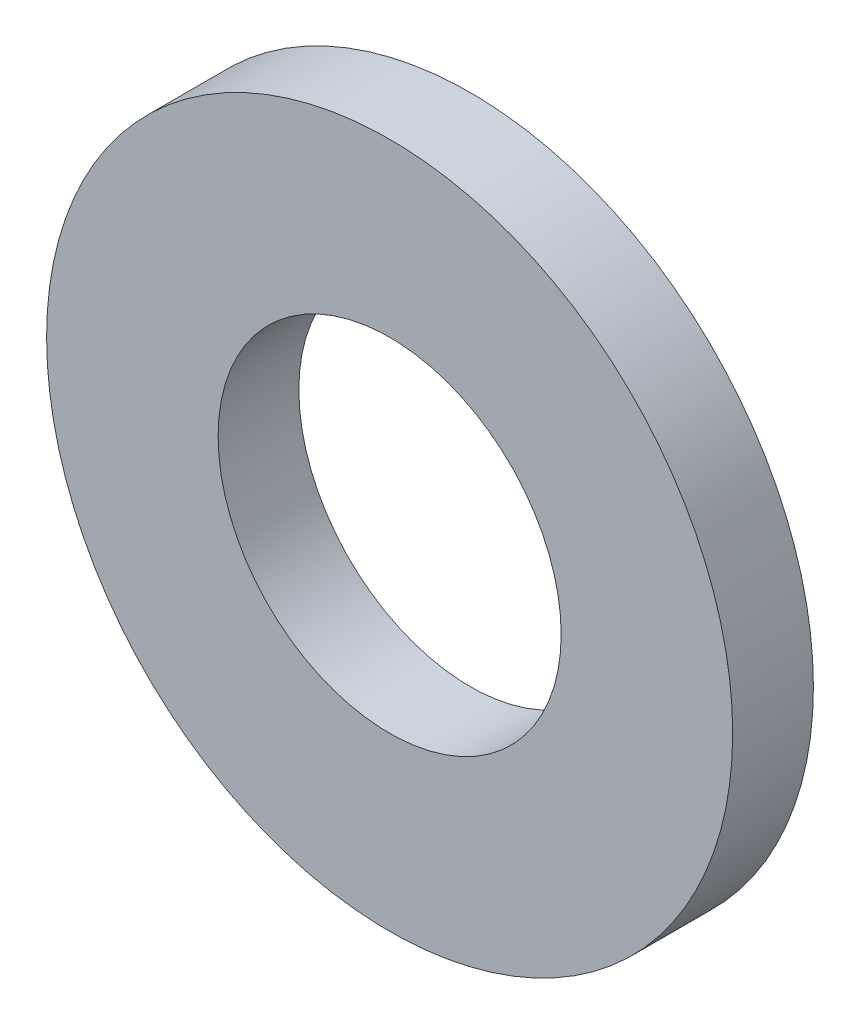
ISO-10303-21;
HEADER;
FILE_DESCRIPTION(('STEP AP214'),'2;1');
FILE_NAME('part.step','',(''),(''),'','','');
FILE_SCHEMA(('AUTOMOTIVE_DESIGN { 1 0 10303 214 1 1 1 1 }'));
ENDSEC;
DATA;
#1=APPLICATION_CONTEXT('core data for automotive mechanical design processes');
#2=APPLICATION_PROTOCOL_DEFINITION('international standard','automotive_design',2000,#1);
#3=PRODUCT_CONTEXT('',#1,'mechanical');
#4=PRODUCT('Part','Part','',(#3));
#5=PRODUCT_RELATED_PRODUCT_CATEGORY('part','',(#4));
#6=PRODUCT_DEFINITION_FORMATION('','',#4);
#7=PRODUCT_DEFINITION_CONTEXT('part definition',#1,'design');
#8=PRODUCT_DEFINITION('design','',#6,#7);
#9=PRODUCT_DEFINITION_SHAPE('','',#8);
#10=(LENGTH_UNIT() NAMED_UNIT(*) SI_UNIT(.MILLI.,.METRE.));
#11=(NAMED_UNIT(*) PLANE_ANGLE_UNIT() SI_UNIT($,.RADIAN.));
#12=(NAMED_UNIT(*) SI_UNIT($,.STERADIAN.) SOLID_ANGLE_UNIT());
#13=UNCERTAINTY_MEASURE_WITH_UNIT(LENGTH_MEASURE(1.E-05),#10,'distance_accuracy_value','');
#14=(GEOMETRIC_REPRESENTATION_CONTEXT(3) GLOBAL_UNCERTAINTY_ASSIGNED_CONTEXT((#13)) GLOBAL_UNIT_ASSIGNED_CONTEXT((#10,
#11,#12)) REPRESENTATION_CONTEXT('',''));
#15=CARTESIAN_POINT('',(0.,0.,0.));
#16=DIRECTION('',(0.,0.,1.));
#17=DIRECTION('',(1.,0.,0.));
#18=AXIS2_PLACEMENT_3D('',#15,#16,#17);
#19=CARTESIAN_POINT('',(1.56125112837913E-13,-5.64659430324355E-13,2.));
#20=DIRECTION('',(0.,0.,1.));
#21=DIRECTION('',(1.,0.,0.));
#22=AXIS2_PLACEMENT_3D('',#19,#20,#21);
#23=PLANE('',#22);
#24=CARTESIAN_POINT('',(1.56125112837913E-13,-5.64659430324355E-13,2.));
#25=DIRECTION('',(0.,0.,1.));
#26=DIRECTION('',(1.,0.,0.));
#27=AXIS2_PLACEMENT_3D('',#24,#25,#26);
#28=CIRCLE('',#27,8.50000000000001);
#29=CARTESIAN_POINT('',(8.50000000000017,-5.64659430324355E-13,2.));
#30=VERTEX_POINT('',#29);
#31=EDGE_CURVE('E10',#30,#30,#28,.T.);
#32=ORIENTED_EDGE('',*,*,#31,.T.);
#33=EDGE_LOOP('',(#32));
#34=FACE_BOUND('',#33,.T.);
#35=CARTESIAN_POINT('',(1.56125112837913E-13,-5.64659430324355E-13,2.));
#36=DIRECTION('',(0.,0.,1.));
#37=DIRECTION('',(1.,0.,0.));
#38=AXIS2_PLACEMENT_3D('',#35,#36,#37);
#39=CIRCLE('',#38,4.25000000000001);
#40=CARTESIAN_POINT('',(4.25000000000017,-5.64659430324355E-13,2.));
#41=VERTEX_POINT('',#40);
#42=EDGE_CURVE('E41',#41,#41,#39,.T.);
#43=ORIENTED_EDGE('',*,*,#42,.F.);
#44=EDGE_LOOP('',(#43));
#45=FACE_BOUND('',#44,.T.);
#46=ADVANCED_FACE('F30',(#34,#45),#23,.T.);
#47=CARTESIAN_POINT('',(1.56125112837913E-13,-5.64659430324355E-13,0.));
#48=DIRECTION('',(0.,0.,1.));
#49=DIRECTION('',(1.,0.,0.));
#50=AXIS2_PLACEMENT_3D('',#47,#48,#49);
#51=PLANE('',#50);
#52=CARTESIAN_POINT('',(1.56125112837913E-13,-5.64659430324355E-13,0.));
#53=DIRECTION('',(0.,0.,1.));
#54=DIRECTION('',(1.,0.,0.));
#55=AXIS2_PLACEMENT_3D('',#52,#53,#54);
#56=CIRCLE('',#55,8.50000000000001);
#57=CARTESIAN_POINT('',(8.50000000000017,-5.64659430324355E-13,0.));
#58=VERTEX_POINT('',#57);
#59=EDGE_CURVE('E34',#58,#58,#56,.T.);
#60=ORIENTED_EDGE('',*,*,#59,.F.);
#61=EDGE_LOOP('',(#60));
#62=FACE_BOUND('',#61,.T.);
#63=CARTESIAN_POINT('',(1.56125112837913E-13,-5.64659430324355E-13,0.));
#64=DIRECTION('',(0.,0.,1.));
#65=DIRECTION('',(1.,0.,0.));
#66=AXIS2_PLACEMENT_3D('',#63,#64,#65);
#67=CIRCLE('',#66,4.25000000000001);
#68=CARTESIAN_POINT('',(4.25000000000017,-5.64659430324355E-13,0.));
#69=VERTEX_POINT('',#68);
#70=EDGE_CURVE('E43',#69,#69,#67,.T.);
#71=ORIENTED_EDGE('',*,*,#70,.T.);
#72=EDGE_LOOP('',(#71));
#73=FACE_BOUND('',#72,.T.);
#74=ADVANCED_FACE('F53',(#62,#73),#51,.F.);
#75=CARTESIAN_POINT('',(1.56125112837913E-13,-5.64659430324355E-13,2.));
#76=DIRECTION('',(0.,0.,-1.));
#77=DIRECTION('',(-1.,0.,0.));
#78=AXIS2_PLACEMENT_3D('',#75,#76,#77);
#79=CYLINDRICAL_SURFACE('',#78,8.50000000000001);
#80=ORIENTED_EDGE('',*,*,#31,.F.);
#81=EDGE_LOOP('',(#80));
#82=FACE_BOUND('',#81,.T.);
#83=ORIENTED_EDGE('',*,*,#59,.T.);
#84=EDGE_LOOP('',(#83));
#85=FACE_BOUND('',#84,.T.);
#86=ADVANCED_FACE('F32',(#82,#85),#79,.T.);
#87=CARTESIAN_POINT('',(1.56125112837913E-13,-5.64659430324355E-13,2.));
#88=DIRECTION('',(0.,0.,-1.));
#89=DIRECTION('',(-1.,0.,0.));
#90=AXIS2_PLACEMENT_3D('',#87,#88,#89);
#91=CYLINDRICAL_SURFACE('',#90,4.25000000000001);
#92=ORIENTED_EDGE('',*,*,#42,.T.);
#93=EDGE_LOOP('',(#92));
#94=FACE_BOUND('',#93,.T.);
#95=ORIENTED_EDGE('',*,*,#70,.F.);
#96=EDGE_LOOP('',(#95));
#97=FACE_BOUND('',#96,.T.);
#98=ADVANCED_FACE('F49',(#94,#97),#91,.F.);
#99=CLOSED_SHELL('',(#46,#74,#86,#98));
#100=MANIFOLD_SOLID_BREP('B2',#99);
#101=ADVANCED_BREP_SHAPE_REPRESENTATION('',(#18,#100),#14);
#102=SHAPE_DEFINITION_REPRESENTATION(#9,#101);
ENDSEC;
END-ISO-10303-21;
